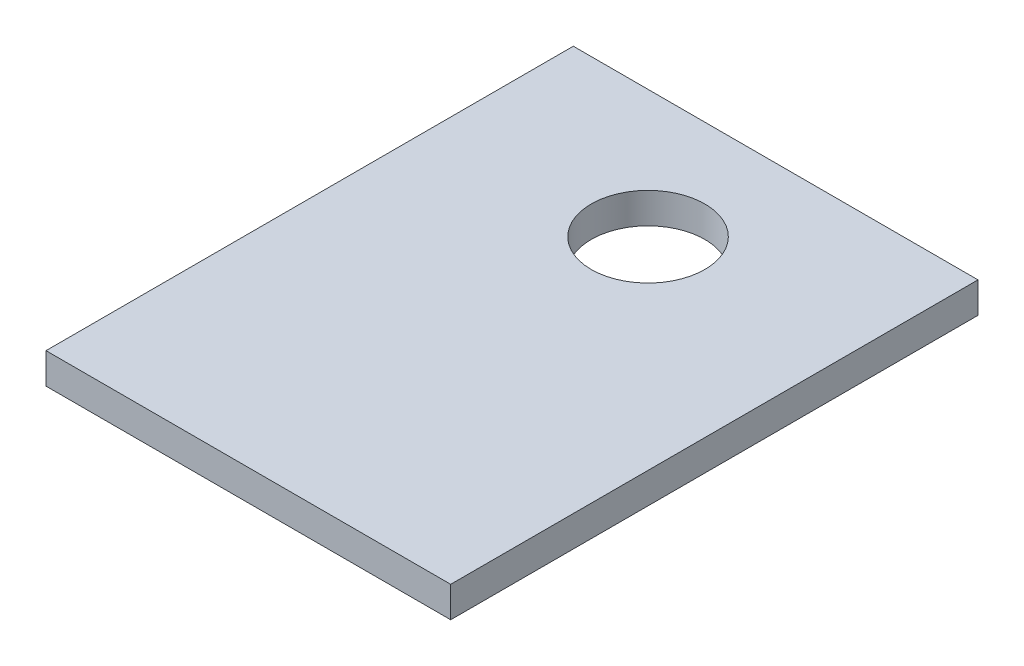
ISO-10303-21;
HEADER;
FILE_DESCRIPTION(('STEP AP214'),'2;1');
FILE_NAME('part.step','',(''),(''),'','','');
FILE_SCHEMA(('AUTOMOTIVE_DESIGN { 1 0 10303 214 1 1 1 1 }'));
ENDSEC;
DATA;
#1=APPLICATION_CONTEXT('core data for automotive mechanical design processes');
#2=APPLICATION_PROTOCOL_DEFINITION('international standard','automotive_design',2000,#1);
#3=PRODUCT_CONTEXT('',#1,'mechanical');
#4=PRODUCT('Part','Part','',(#3));
#5=PRODUCT_RELATED_PRODUCT_CATEGORY('part','',(#4));
#6=PRODUCT_DEFINITION_FORMATION('','',#4);
#7=PRODUCT_DEFINITION_CONTEXT('part definition',#1,'design');
#8=PRODUCT_DEFINITION('design','',#6,#7);
#9=PRODUCT_DEFINITION_SHAPE('','',#8);
#10=(LENGTH_UNIT() NAMED_UNIT(*) SI_UNIT(.MILLI.,.METRE.));
#11=(NAMED_UNIT(*) PLANE_ANGLE_UNIT() SI_UNIT($,.RADIAN.));
#12=(NAMED_UNIT(*) SI_UNIT($,.STERADIAN.) SOLID_ANGLE_UNIT());
#13=UNCERTAINTY_MEASURE_WITH_UNIT(LENGTH_MEASURE(1.E-05),#10,'distance_accuracy_value','');
#14=(GEOMETRIC_REPRESENTATION_CONTEXT(3) GLOBAL_UNCERTAINTY_ASSIGNED_CONTEXT((#13)) GLOBAL_UNIT_ASSIGNED_CONTEXT((#10,
#11,#12)) REPRESENTATION_CONTEXT('',''));
#15=CARTESIAN_POINT('',(0.,0.,0.));
#16=DIRECTION('',(0.,0.,1.));
#17=DIRECTION('',(1.,0.,0.));
#18=AXIS2_PLACEMENT_3D('',#15,#16,#17);
#19=CARTESIAN_POINT('',(0.,5.,0.));
#20=DIRECTION('',(0.,-1.,0.));
#21=DIRECTION('',(0.,0.,-1.));
#22=AXIS2_PLACEMENT_3D('',#19,#20,#21);
#23=PLANE('',#22);
#24=DIRECTION('',(0.,0.,1.));
#25=VECTOR('',#24,1.);
#26=CARTESIAN_POINT('',(0.,5.,0.));
#27=LINE('',#26,#25);
#28=CARTESIAN_POINT('',(0.,5.,-85.7541926122451));
#29=VERTEX_POINT('',#28);
#30=CARTESIAN_POINT('',(0.,5.,0.));
#31=VERTEX_POINT('',#30);
#32=EDGE_CURVE('E97',#29,#31,#27,.T.);
#33=ORIENTED_EDGE('',*,*,#32,.T.);
#34=DIRECTION('',(1.,0.,0.));
#35=VECTOR('',#34,1.);
#36=CARTESIAN_POINT('',(0.,5.,0.));
#37=LINE('',#36,#35);
#38=CARTESIAN_POINT('',(65.8132655263355,5.,0.));
#39=VERTEX_POINT('',#38);
#40=EDGE_CURVE('E92',#31,#39,#37,.T.);
#41=ORIENTED_EDGE('',*,*,#40,.T.);
#42=DIRECTION('',(0.,0.,-1.));
#43=VECTOR('',#42,1.);
#44=CARTESIAN_POINT('',(65.8132655263355,5.,0.));
#45=LINE('',#44,#43);
#46=CARTESIAN_POINT('',(65.8132655263355,5.,-85.7541926122451));
#47=VERTEX_POINT('',#46);
#48=EDGE_CURVE('E95',#39,#47,#45,.T.);
#49=ORIENTED_EDGE('',*,*,#48,.T.);
#50=DIRECTION('',(-1.,0.,0.));
#51=VECTOR('',#50,1.);
#52=CARTESIAN_POINT('',(0.,5.,-85.7541926122451));
#53=LINE('',#52,#51);
#54=EDGE_CURVE('E62',#47,#29,#53,.T.);
#55=ORIENTED_EDGE('',*,*,#54,.T.);
#56=EDGE_LOOP('',(#33,#41,#49,#55));
#57=FACE_BOUND('',#56,.T.);
#58=CARTESIAN_POINT('',(32.9066327631677,5.,-65.));
#59=DIRECTION('',(0.,1.,0.));
#60=DIRECTION('',(0.,0.,1.));
#61=AXIS2_PLACEMENT_3D('',#58,#59,#60);
#62=CIRCLE('',#61,9.23643322011256);
#63=CARTESIAN_POINT('',(32.9066327631677,5.,-55.7635667798874));
#64=VERTEX_POINT('',#63);
#65=EDGE_CURVE('E117',#64,#64,#62,.T.);
#66=ORIENTED_EDGE('',*,*,#65,.F.);
#67=EDGE_LOOP('',(#66));
#68=FACE_BOUND('',#67,.T.);
#69=ADVANCED_FACE('F44',(#57,#68),#23,.F.);
#70=CARTESIAN_POINT('',(0.,0.,0.));
#71=DIRECTION('',(0.,-1.,0.));
#72=DIRECTION('',(0.,0.,-1.));
#73=AXIS2_PLACEMENT_3D('',#70,#71,#72);
#74=PLANE('',#73);
#75=DIRECTION('',(0.,0.,1.));
#76=VECTOR('',#75,1.);
#77=CARTESIAN_POINT('',(0.,0.,0.));
#78=LINE('',#77,#76);
#79=CARTESIAN_POINT('',(0.,0.,-85.7541926122451));
#80=VERTEX_POINT('',#79);
#81=CARTESIAN_POINT('',(0.,0.,0.));
#82=VERTEX_POINT('',#81);
#83=EDGE_CURVE('E113',#80,#82,#78,.T.);
#84=ORIENTED_EDGE('',*,*,#83,.F.);
#85=DIRECTION('',(-1.,0.,0.));
#86=VECTOR('',#85,1.);
#87=CARTESIAN_POINT('',(0.,0.,-85.7541926122451));
#88=LINE('',#87,#86);
#89=CARTESIAN_POINT('',(65.8132655263355,0.,-85.7541926122451));
#90=VERTEX_POINT('',#89);
#91=EDGE_CURVE('E85',#90,#80,#88,.T.);
#92=ORIENTED_EDGE('',*,*,#91,.F.);
#93=DIRECTION('',(0.,0.,-1.));
#94=VECTOR('',#93,1.);
#95=CARTESIAN_POINT('',(65.8132655263355,0.,0.));
#96=LINE('',#95,#94);
#97=CARTESIAN_POINT('',(65.8132655263355,0.,0.));
#98=VERTEX_POINT('',#97);
#99=EDGE_CURVE('E79',#98,#90,#96,.T.);
#100=ORIENTED_EDGE('',*,*,#99,.F.);
#101=DIRECTION('',(1.,0.,0.));
#102=VECTOR('',#101,1.);
#103=CARTESIAN_POINT('',(0.,0.,0.));
#104=LINE('',#103,#102);
#105=EDGE_CURVE('E102',#82,#98,#104,.T.);
#106=ORIENTED_EDGE('',*,*,#105,.F.);
#107=EDGE_LOOP('',(#84,#92,#100,#106));
#108=FACE_BOUND('',#107,.T.);
#109=CARTESIAN_POINT('',(32.9066327631677,0.,-65.));
#110=DIRECTION('',(0.,1.,0.));
#111=DIRECTION('',(0.,0.,1.));
#112=AXIS2_PLACEMENT_3D('',#109,#110,#111);
#113=CIRCLE('',#112,9.23643322011256);
#114=CARTESIAN_POINT('',(32.9066327631677,0.,-55.7635667798874));
#115=VERTEX_POINT('',#114);
#116=EDGE_CURVE('E135',#115,#115,#113,.T.);
#117=ORIENTED_EDGE('',*,*,#116,.T.);
#118=EDGE_LOOP('',(#117));
#119=FACE_BOUND('',#118,.T.);
#120=ADVANCED_FACE('F130',(#108,#119),#74,.T.);
#121=CARTESIAN_POINT('',(0.,5.,0.));
#122=DIRECTION('',(1.,0.,0.));
#123=DIRECTION('',(0.,0.,-1.));
#124=AXIS2_PLACEMENT_3D('',#121,#122,#123);
#125=PLANE('',#124);
#126=ORIENTED_EDGE('',*,*,#83,.T.);
#127=DIRECTION('',(0.,-1.,0.));
#128=VECTOR('',#127,1.);
#129=CARTESIAN_POINT('',(0.,5.,0.));
#130=LINE('',#129,#128);
#131=EDGE_CURVE('E11',#31,#82,#130,.T.);
#132=ORIENTED_EDGE('',*,*,#131,.F.);
#133=ORIENTED_EDGE('',*,*,#32,.F.);
#134=DIRECTION('',(0.,-1.,0.));
#135=VECTOR('',#134,1.);
#136=CARTESIAN_POINT('',(0.,5.,-85.7541926122451));
#137=LINE('',#136,#135);
#138=EDGE_CURVE('E109',#29,#80,#137,.T.);
#139=ORIENTED_EDGE('',*,*,#138,.T.);
#140=EDGE_LOOP('',(#126,#132,#133,#139));
#141=FACE_BOUND('',#140,.T.);
#142=ADVANCED_FACE('F46',(#141),#125,.F.);
#143=CARTESIAN_POINT('',(0.,5.,0.));
#144=DIRECTION('',(0.,0.,-1.));
#145=DIRECTION('',(-1.,0.,0.));
#146=AXIS2_PLACEMENT_3D('',#143,#144,#145);
#147=PLANE('',#146);
#148=ORIENTED_EDGE('',*,*,#105,.T.);
#149=DIRECTION('',(0.,-1.,0.));
#150=VECTOR('',#149,1.);
#151=CARTESIAN_POINT('',(65.8132655263355,5.,0.));
#152=LINE('',#151,#150);
#153=EDGE_CURVE('E54',#39,#98,#152,.T.);
#154=ORIENTED_EDGE('',*,*,#153,.F.);
#155=ORIENTED_EDGE('',*,*,#40,.F.);
#156=ORIENTED_EDGE('',*,*,#131,.T.);
#157=EDGE_LOOP('',(#148,#154,#155,#156));
#158=FACE_BOUND('',#157,.T.);
#159=ADVANCED_FACE('F101',(#158),#147,.F.);
#160=CARTESIAN_POINT('',(65.8132655263355,5.,0.));
#161=DIRECTION('',(-1.,0.,0.));
#162=DIRECTION('',(0.,0.,1.));
#163=AXIS2_PLACEMENT_3D('',#160,#161,#162);
#164=PLANE('',#163);
#165=ORIENTED_EDGE('',*,*,#99,.T.);
#166=DIRECTION('',(0.,-1.,0.));
#167=VECTOR('',#166,1.);
#168=CARTESIAN_POINT('',(65.8132655263355,5.,-85.7541926122451));
#169=LINE('',#168,#167);
#170=EDGE_CURVE('E104',#47,#90,#169,.T.);
#171=ORIENTED_EDGE('',*,*,#170,.F.);
#172=ORIENTED_EDGE('',*,*,#48,.F.);
#173=ORIENTED_EDGE('',*,*,#153,.T.);
#174=EDGE_LOOP('',(#165,#171,#172,#173));
#175=FACE_BOUND('',#174,.T.);
#176=ADVANCED_FACE('F105',(#175),#164,.F.);
#177=CARTESIAN_POINT('',(0.,5.,-85.7541926122451));
#178=DIRECTION('',(0.,0.,1.));
#179=DIRECTION('',(1.,0.,0.));
#180=AXIS2_PLACEMENT_3D('',#177,#178,#179);
#181=PLANE('',#180);
#182=ORIENTED_EDGE('',*,*,#91,.T.);
#183=ORIENTED_EDGE('',*,*,#138,.F.);
#184=ORIENTED_EDGE('',*,*,#54,.F.);
#185=ORIENTED_EDGE('',*,*,#170,.T.);
#186=EDGE_LOOP('',(#182,#183,#184,#185));
#187=FACE_BOUND('',#186,.T.);
#188=ADVANCED_FACE('F127',(#187),#181,.F.);
#189=CARTESIAN_POINT('',(32.9066327631677,5.,-65.));
#190=DIRECTION('',(0.,-1.,0.));
#191=DIRECTION('',(0.,0.,-1.));
#192=AXIS2_PLACEMENT_3D('',#189,#190,#191);
#193=CYLINDRICAL_SURFACE('',#192,9.23643322011256);
#194=ORIENTED_EDGE('',*,*,#65,.T.);
#195=EDGE_LOOP('',(#194));
#196=FACE_BOUND('',#195,.T.);
#197=ORIENTED_EDGE('',*,*,#116,.F.);
#198=EDGE_LOOP('',(#197));
#199=FACE_BOUND('',#198,.T.);
#200=ADVANCED_FACE('F143',(#196,#199),#193,.F.);
#201=CLOSED_SHELL('',(#69,#120,#142,#159,#176,#188,#200));
#202=MANIFOLD_SOLID_BREP('B2',#201);
#203=ADVANCED_BREP_SHAPE_REPRESENTATION('',(#18,#202),#14);
#204=SHAPE_DEFINITION_REPRESENTATION(#9,#203);
ENDSEC;
END-ISO-10303-21;
